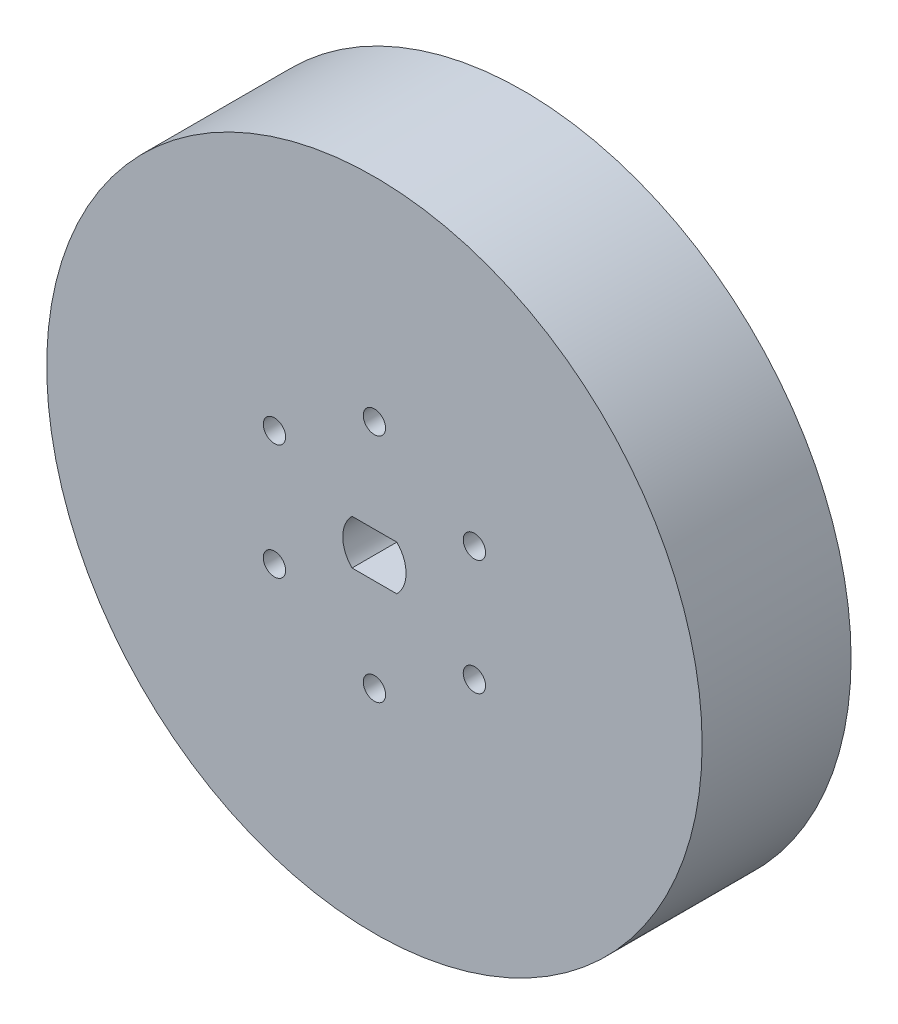
ISO-10303-21;
HEADER;
FILE_DESCRIPTION(('STEP AP214'),'2;1');
FILE_NAME('part.step','',(''),(''),'','','');
FILE_SCHEMA(('AUTOMOTIVE_DESIGN { 1 0 10303 214 1 1 1 1 }'));
ENDSEC;
DATA;
#1=APPLICATION_CONTEXT('core data for automotive mechanical design processes');
#2=APPLICATION_PROTOCOL_DEFINITION('international standard','automotive_design',2000,#1);
#3=PRODUCT_CONTEXT('',#1,'mechanical');
#4=PRODUCT('Part','Part','',(#3));
#5=PRODUCT_RELATED_PRODUCT_CATEGORY('part','',(#4));
#6=PRODUCT_DEFINITION_FORMATION('','',#4);
#7=PRODUCT_DEFINITION_CONTEXT('part definition',#1,'design');
#8=PRODUCT_DEFINITION('design','',#6,#7);
#9=PRODUCT_DEFINITION_SHAPE('','',#8);
#10=(LENGTH_UNIT() NAMED_UNIT(*) SI_UNIT(.MILLI.,.METRE.));
#11=(NAMED_UNIT(*) PLANE_ANGLE_UNIT() SI_UNIT($,.RADIAN.));
#12=(NAMED_UNIT(*) SI_UNIT($,.STERADIAN.) SOLID_ANGLE_UNIT());
#13=UNCERTAINTY_MEASURE_WITH_UNIT(LENGTH_MEASURE(1.E-05),#10,'distance_accuracy_value','');
#14=(GEOMETRIC_REPRESENTATION_CONTEXT(3) GLOBAL_UNCERTAINTY_ASSIGNED_CONTEXT((#13)) GLOBAL_UNIT_ASSIGNED_CONTEXT((#10,
#11,#12)) REPRESENTATION_CONTEXT('',''));
#15=CARTESIAN_POINT('',(0.,0.,0.));
#16=DIRECTION('',(0.,0.,1.));
#17=DIRECTION('',(1.,0.,0.));
#18=AXIS2_PLACEMENT_3D('',#15,#16,#17);
#19=CARTESIAN_POINT('',(-42.5704961768132,41.3632036033177,20.));
#20=DIRECTION('',(0.,0.,-1.));
#21=DIRECTION('',(-1.,0.,0.));
#22=AXIS2_PLACEMENT_3D('',#19,#20,#21);
#23=CYLINDRICAL_SURFACE('',#22,1.5);
#24=CARTESIAN_POINT('',(-42.5704961768132,41.3632036033177,20.));
#25=DIRECTION('',(0.,0.,-1.));
#26=DIRECTION('',(-1.,0.,0.));
#27=AXIS2_PLACEMENT_3D('',#24,#25,#26);
#28=CIRCLE('',#27,1.5);
#29=CARTESIAN_POINT('',(-44.0704961768132,41.3632036033177,20.));
#30=VERTEX_POINT('',#29);
#31=EDGE_CURVE('E136',#30,#30,#28,.T.);
#32=ORIENTED_EDGE('',*,*,#31,.F.);
#33=EDGE_LOOP('',(#32));
#34=FACE_BOUND('',#33,.T.);
#35=CARTESIAN_POINT('',(-42.5704961768132,41.3632036033177,3.));
#36=DIRECTION('',(0.,0.,-1.));
#37=DIRECTION('',(-1.,0.,0.));
#38=AXIS2_PLACEMENT_3D('',#35,#36,#37);
#39=CIRCLE('',#38,1.5);
#40=CARTESIAN_POINT('',(-44.0704961768132,41.3632036033177,3.));
#41=VERTEX_POINT('',#40);
#42=EDGE_CURVE('E45',#41,#41,#39,.F.);
#43=ORIENTED_EDGE('',*,*,#42,.F.);
#44=EDGE_LOOP('',(#43));
#45=FACE_BOUND('',#44,.T.);
#46=ADVANCED_FACE('F41',(#34,#45),#23,.F.);
#47=CARTESIAN_POINT('',(-42.5704961768132,25.8632036033177,20.));
#48=DIRECTION('',(0.,0.,-1.));
#49=DIRECTION('',(-1.,0.,0.));
#50=AXIS2_PLACEMENT_3D('',#47,#48,#49);
#51=CYLINDRICAL_SURFACE('',#50,4.25);
#52=CARTESIAN_POINT('',(-42.5704961768132,25.8632036033177,0.));
#53=DIRECTION('',(0.,0.,1.));
#54=DIRECTION('',(1.,0.,0.));
#55=AXIS2_PLACEMENT_3D('',#52,#53,#54);
#56=CIRCLE('',#55,4.25);
#57=CARTESIAN_POINT('',(-39.5652923567703,22.8579997832749,0.));
#58=VERTEX_POINT('',#57);
#59=CARTESIAN_POINT('',(-39.5652923567703,28.8684074233606,0.));
#60=VERTEX_POINT('',#59);
#61=EDGE_CURVE('E133',#58,#60,#56,.T.);
#62=ORIENTED_EDGE('',*,*,#61,.F.);
#63=DIRECTION('',(0.,0.,-1.));
#64=VECTOR('',#63,1.);
#65=CARTESIAN_POINT('',(-39.5652923567703,22.8579997832749,20.));
#66=LINE('',#65,#64);
#67=CARTESIAN_POINT('',(-39.5652923567703,22.8579997832749,20.));
#68=VERTEX_POINT('',#67);
#69=EDGE_CURVE('E11',#68,#58,#66,.T.);
#70=ORIENTED_EDGE('',*,*,#69,.F.);
#71=CARTESIAN_POINT('',(-42.5704961768132,25.8632036033177,20.));
#72=DIRECTION('',(0.,0.,1.));
#73=DIRECTION('',(1.,0.,0.));
#74=AXIS2_PLACEMENT_3D('',#71,#72,#73);
#75=CIRCLE('',#74,4.25);
#76=CARTESIAN_POINT('',(-39.5652923567703,28.8684074233606,20.));
#77=VERTEX_POINT('',#76);
#78=EDGE_CURVE('E93',#68,#77,#75,.T.);
#79=ORIENTED_EDGE('',*,*,#78,.T.);
#80=DIRECTION('',(0.,0.,-1.));
#81=VECTOR('',#80,1.);
#82=CARTESIAN_POINT('',(-39.5652923567703,28.8684074233606,20.));
#83=LINE('',#82,#81);
#84=EDGE_CURVE('E82',#77,#60,#83,.T.);
#85=ORIENTED_EDGE('',*,*,#84,.T.);
#86=EDGE_LOOP('',(#62,#70,#79,#85));
#87=FACE_BOUND('',#86,.T.);
#88=ADVANCED_FACE('F152',(#87),#51,.F.);
#89=CARTESIAN_POINT('',(0.,22.8579997832749,20.));
#90=DIRECTION('',(0.,-1.,0.));
#91=DIRECTION('',(1.,0.,0.));
#92=AXIS2_PLACEMENT_3D('',#89,#90,#91);
#93=PLANE('',#92);
#94=DIRECTION('',(-1.,0.,0.));
#95=VECTOR('',#94,1.);
#96=CARTESIAN_POINT('',(0.,22.8579997832749,0.));
#97=LINE('',#96,#95);
#98=CARTESIAN_POINT('',(-45.575699996856,22.8579997832749,0.));
#99=VERTEX_POINT('',#98);
#100=EDGE_CURVE('E99',#58,#99,#97,.T.);
#101=ORIENTED_EDGE('',*,*,#100,.T.);
#102=DIRECTION('',(0.,0.,-1.));
#103=VECTOR('',#102,1.);
#104=CARTESIAN_POINT('',(-45.575699996856,22.8579997832749,20.));
#105=LINE('',#104,#103);
#106=CARTESIAN_POINT('',(-45.575699996856,22.8579997832749,20.));
#107=VERTEX_POINT('',#106);
#108=EDGE_CURVE('E52',#107,#99,#105,.T.);
#109=ORIENTED_EDGE('',*,*,#108,.F.);
#110=DIRECTION('',(-1.,0.,0.));
#111=VECTOR('',#110,1.);
#112=CARTESIAN_POINT('',(0.,22.8579997832749,20.));
#113=LINE('',#112,#111);
#114=EDGE_CURVE('E87',#68,#107,#113,.T.);
#115=ORIENTED_EDGE('',*,*,#114,.F.);
#116=ORIENTED_EDGE('',*,*,#69,.T.);
#117=EDGE_LOOP('',(#101,#109,#115,#116));
#118=FACE_BOUND('',#117,.T.);
#119=ADVANCED_FACE('F43',(#118),#93,.F.);
#120=CARTESIAN_POINT('',(-45.575699996856,28.8684074233606,0.));
#121=VERTEX_POINT('',#120);
#122=EDGE_CURVE('E121',#121,#99,#56,.T.);
#123=ORIENTED_EDGE('',*,*,#122,.F.);
#124=DIRECTION('',(0.,0.,-1.));
#125=VECTOR('',#124,1.);
#126=CARTESIAN_POINT('',(-45.575699996856,28.8684074233606,20.));
#127=LINE('',#126,#125);
#128=CARTESIAN_POINT('',(-45.575699996856,28.8684074233606,20.));
#129=VERTEX_POINT('',#128);
#130=EDGE_CURVE('E75',#129,#121,#127,.T.);
#131=ORIENTED_EDGE('',*,*,#130,.F.);
#132=EDGE_CURVE('E92',#129,#107,#75,.T.);
#133=ORIENTED_EDGE('',*,*,#132,.T.);
#134=ORIENTED_EDGE('',*,*,#108,.T.);
#135=EDGE_LOOP('',(#123,#131,#133,#134));
#136=FACE_BOUND('',#135,.T.);
#137=ADVANCED_FACE('F105',(#136),#51,.F.);
#138=CARTESIAN_POINT('',(0.,28.8684074233606,20.));
#139=DIRECTION('',(0.,1.,0.));
#140=DIRECTION('',(0.,0.,1.));
#141=AXIS2_PLACEMENT_3D('',#138,#139,#140);
#142=PLANE('',#141);
#143=DIRECTION('',(1.,0.,0.));
#144=VECTOR('',#143,1.);
#145=CARTESIAN_POINT('',(0.,28.8684074233606,0.));
#146=LINE('',#145,#144);
#147=EDGE_CURVE('E116',#121,#60,#146,.T.);
#148=ORIENTED_EDGE('',*,*,#147,.T.);
#149=ORIENTED_EDGE('',*,*,#84,.F.);
#150=DIRECTION('',(1.,0.,0.));
#151=VECTOR('',#150,1.);
#152=CARTESIAN_POINT('',(0.,28.8684074233606,20.));
#153=LINE('',#152,#151);
#154=EDGE_CURVE('E60',#129,#77,#153,.T.);
#155=ORIENTED_EDGE('',*,*,#154,.F.);
#156=ORIENTED_EDGE('',*,*,#130,.T.);
#157=EDGE_LOOP('',(#148,#149,#155,#156));
#158=FACE_BOUND('',#157,.T.);
#159=ADVANCED_FACE('F142',(#158),#142,.F.);
#160=CARTESIAN_POINT('',(-42.5704961768132,25.8632036033177,20.));
#161=DIRECTION('',(0.,0.,-1.));
#162=DIRECTION('',(-1.,0.,0.));
#163=AXIS2_PLACEMENT_3D('',#160,#161,#162);
#164=CYLINDRICAL_SURFACE('',#163,44.);
#165=CARTESIAN_POINT('',(-42.5704961768132,25.8632036033177,20.));
#166=DIRECTION('',(0.,0.,1.));
#167=DIRECTION('',(1.,0.,0.));
#168=AXIS2_PLACEMENT_3D('',#165,#166,#167);
#169=CIRCLE('',#168,44.);
#170=CARTESIAN_POINT('',(1.42950382318684,25.8632036033177,20.));
#171=VERTEX_POINT('',#170);
#172=EDGE_CURVE('E109',#171,#171,#169,.T.);
#173=ORIENTED_EDGE('',*,*,#172,.F.);
#174=EDGE_LOOP('',(#173));
#175=FACE_BOUND('',#174,.T.);
#176=CARTESIAN_POINT('',(-42.5704961768132,25.8632036033177,0.));
#177=DIRECTION('',(0.,0.,1.));
#178=DIRECTION('',(1.,0.,0.));
#179=AXIS2_PLACEMENT_3D('',#176,#177,#178);
#180=CIRCLE('',#179,44.);
#181=CARTESIAN_POINT('',(1.42950382318684,25.8632036033177,0.));
#182=VERTEX_POINT('',#181);
#183=EDGE_CURVE('E113',#182,#182,#180,.T.);
#184=ORIENTED_EDGE('',*,*,#183,.T.);
#185=EDGE_LOOP('',(#184));
#186=FACE_BOUND('',#185,.T.);
#187=ADVANCED_FACE('F144',(#175,#186),#164,.T.);
#188=CARTESIAN_POINT('',(0.,0.,20.));
#189=DIRECTION('',(0.,0.,1.));
#190=DIRECTION('',(1.,0.,0.));
#191=AXIS2_PLACEMENT_3D('',#188,#189,#190);
#192=PLANE('',#191);
#193=CARTESIAN_POINT('',(-29.1471024181545,33.6132036033179,20.));
#194=DIRECTION('',(0.,0.,-1.));
#195=DIRECTION('',(-0.50000000000001,0.866025403784433,0.));
#196=AXIS2_PLACEMENT_3D('',#193,#194,#195);
#197=CIRCLE('',#196,1.5);
#198=CARTESIAN_POINT('',(-29.8971024181545,34.9122417089946,20.));
#199=VERTEX_POINT('',#198);
#200=EDGE_CURVE('E218',#199,#199,#197,.T.);
#201=ORIENTED_EDGE('',*,*,#200,.T.);
#202=EDGE_LOOP('',(#201));
#203=FACE_BOUND('',#202,.T.);
#204=CARTESIAN_POINT('',(-29.1471024181543,18.1132036033179,20.));
#205=DIRECTION('',(0.,0.,-1.));
#206=DIRECTION('',(0.499999999999992,0.866025403784443,0.));
#207=AXIS2_PLACEMENT_3D('',#204,#205,#206);
#208=CIRCLE('',#207,1.5);
#209=CARTESIAN_POINT('',(-28.3971024181543,19.4122417089945,20.));
#210=VERTEX_POINT('',#209);
#211=EDGE_CURVE('E222',#210,#210,#208,.T.);
#212=ORIENTED_EDGE('',*,*,#211,.T.);
#213=EDGE_LOOP('',(#212));
#214=FACE_BOUND('',#213,.T.);
#215=CARTESIAN_POINT('',(-42.5704961768132,10.3632036033178,20.));
#216=DIRECTION('',(0.,0.,-1.));
#217=DIRECTION('',(1.,0.,0.));
#218=AXIS2_PLACEMENT_3D('',#215,#216,#217);
#219=CIRCLE('',#218,1.5);
#220=CARTESIAN_POINT('',(-41.0704961768132,10.3632036033178,20.));
#221=VERTEX_POINT('',#220);
#222=EDGE_CURVE('E227',#221,#221,#219,.T.);
#223=ORIENTED_EDGE('',*,*,#222,.T.);
#224=EDGE_LOOP('',(#223));
#225=FACE_BOUND('',#224,.T.);
#226=CARTESIAN_POINT('',(-55.9938899354719,18.1132036033177,20.));
#227=DIRECTION('',(0.,0.,-1.));
#228=DIRECTION('',(0.500000000000004,-0.866025403784436,0.));
#229=AXIS2_PLACEMENT_3D('',#226,#227,#228);
#230=CIRCLE('',#229,1.5);
#231=CARTESIAN_POINT('',(-55.2438899354719,16.814165497641,20.));
#232=VERTEX_POINT('',#231);
#233=EDGE_CURVE('E208',#232,#232,#230,.T.);
#234=ORIENTED_EDGE('',*,*,#233,.T.);
#235=EDGE_LOOP('',(#234));
#236=FACE_BOUND('',#235,.T.);
#237=CARTESIAN_POINT('',(-55.993889935472,33.6132036033177,20.));
#238=DIRECTION('',(0.,0.,-1.));
#239=DIRECTION('',(-0.499999999999998,-0.86602540378444,0.));
#240=AXIS2_PLACEMENT_3D('',#237,#238,#239);
#241=CIRCLE('',#240,1.5);
#242=CARTESIAN_POINT('',(-56.743889935472,32.314165497641,20.));
#243=VERTEX_POINT('',#242);
#244=EDGE_CURVE('E201',#243,#243,#241,.T.);
#245=ORIENTED_EDGE('',*,*,#244,.T.);
#246=EDGE_LOOP('',(#245));
#247=FACE_BOUND('',#246,.T.);
#248=ORIENTED_EDGE('',*,*,#31,.T.);
#249=EDGE_LOOP('',(#248));
#250=FACE_BOUND('',#249,.T.);
#251=ORIENTED_EDGE('',*,*,#78,.F.);
#252=ORIENTED_EDGE('',*,*,#114,.T.);
#253=ORIENTED_EDGE('',*,*,#132,.F.);
#254=ORIENTED_EDGE('',*,*,#154,.T.);
#255=EDGE_LOOP('',(#251,#252,#253,#254));
#256=FACE_BOUND('',#255,.T.);
#257=ORIENTED_EDGE('',*,*,#172,.T.);
#258=EDGE_LOOP('',(#257));
#259=FACE_BOUND('',#258,.T.);
#260=ADVANCED_FACE('F89',(#203,#214,#225,#236,#247,#250,#256,#259),#192,.T.);
#261=CARTESIAN_POINT('',(0.,0.,0.));
#262=DIRECTION('',(0.,0.,1.));
#263=DIRECTION('',(1.,0.,0.));
#264=AXIS2_PLACEMENT_3D('',#261,#262,#263);
#265=PLANE('',#264);
#266=CARTESIAN_POINT('',(-29.1471024181545,33.6132036033179,0.));
#267=DIRECTION('',(0.,0.,-1.));
#268=DIRECTION('',(-0.50000000000001,0.866025403784433,0.));
#269=AXIS2_PLACEMENT_3D('',#266,#267,#268);
#270=CIRCLE('',#269,3.);
#271=CARTESIAN_POINT('',(-30.6471024181545,36.2112798146712,0.));
#272=VERTEX_POINT('',#271);
#273=EDGE_CURVE('E178',#272,#272,#270,.T.);
#274=ORIENTED_EDGE('',*,*,#273,.F.);
#275=EDGE_LOOP('',(#274));
#276=FACE_BOUND('',#275,.T.);
#277=CARTESIAN_POINT('',(-29.1471024181543,18.1132036033179,0.));
#278=DIRECTION('',(0.,0.,-1.));
#279=DIRECTION('',(0.499999999999992,0.866025403784443,0.));
#280=AXIS2_PLACEMENT_3D('',#277,#278,#279);
#281=CIRCLE('',#280,3.);
#282=CARTESIAN_POINT('',(-27.6471024181543,20.7112798146712,0.));
#283=VERTEX_POINT('',#282);
#284=EDGE_CURVE('E182',#283,#283,#281,.T.);
#285=ORIENTED_EDGE('',*,*,#284,.F.);
#286=EDGE_LOOP('',(#285));
#287=FACE_BOUND('',#286,.T.);
#288=CARTESIAN_POINT('',(-42.5704961768132,10.3632036033178,0.));
#289=DIRECTION('',(0.,0.,-1.));
#290=DIRECTION('',(1.,0.,0.));
#291=AXIS2_PLACEMENT_3D('',#288,#289,#290);
#292=CIRCLE('',#291,3.);
#293=CARTESIAN_POINT('',(-39.5704961768132,10.3632036033178,0.));
#294=VERTEX_POINT('',#293);
#295=EDGE_CURVE('E186',#294,#294,#292,.T.);
#296=ORIENTED_EDGE('',*,*,#295,.F.);
#297=EDGE_LOOP('',(#296));
#298=FACE_BOUND('',#297,.T.);
#299=CARTESIAN_POINT('',(-55.9938899354719,18.1132036033177,0.));
#300=DIRECTION('',(0.,0.,-1.));
#301=DIRECTION('',(0.500000000000004,-0.866025403784436,0.));
#302=AXIS2_PLACEMENT_3D('',#299,#300,#301);
#303=CIRCLE('',#302,3.);
#304=CARTESIAN_POINT('',(-54.4938899354719,15.5151273919644,0.));
#305=VERTEX_POINT('',#304);
#306=EDGE_CURVE('E190',#305,#305,#303,.T.);
#307=ORIENTED_EDGE('',*,*,#306,.F.);
#308=EDGE_LOOP('',(#307));
#309=FACE_BOUND('',#308,.T.);
#310=CARTESIAN_POINT('',(-55.993889935472,33.6132036033177,0.));
#311=DIRECTION('',(0.,0.,-1.));
#312=DIRECTION('',(-0.499999999999998,-0.86602540378444,0.));
#313=AXIS2_PLACEMENT_3D('',#310,#311,#312);
#314=CIRCLE('',#313,3.);
#315=CARTESIAN_POINT('',(-57.493889935472,31.0151273919644,0.));
#316=VERTEX_POINT('',#315);
#317=EDGE_CURVE('E194',#316,#316,#314,.T.);
#318=ORIENTED_EDGE('',*,*,#317,.F.);
#319=EDGE_LOOP('',(#318));
#320=FACE_BOUND('',#319,.T.);
#321=CARTESIAN_POINT('',(-42.5704961768132,41.3632036033177,0.));
#322=DIRECTION('',(0.,0.,-1.));
#323=DIRECTION('',(-1.,0.,0.));
#324=AXIS2_PLACEMENT_3D('',#321,#322,#323);
#325=CIRCLE('',#324,3.);
#326=CARTESIAN_POINT('',(-45.5704961768132,41.3632036033177,0.));
#327=VERTEX_POINT('',#326);
#328=EDGE_CURVE('E197',#327,#327,#325,.T.);
#329=ORIENTED_EDGE('',*,*,#328,.F.);
#330=EDGE_LOOP('',(#329));
#331=FACE_BOUND('',#330,.T.);
#332=ORIENTED_EDGE('',*,*,#61,.T.);
#333=ORIENTED_EDGE('',*,*,#147,.F.);
#334=ORIENTED_EDGE('',*,*,#122,.T.);
#335=ORIENTED_EDGE('',*,*,#100,.F.);
#336=EDGE_LOOP('',(#332,#333,#334,#335));
#337=FACE_BOUND('',#336,.T.);
#338=ORIENTED_EDGE('',*,*,#183,.F.);
#339=EDGE_LOOP('',(#338));
#340=FACE_BOUND('',#339,.T.);
#341=ADVANCED_FACE('F140',(#276,#287,#298,#309,#320,#331,#337,#340),#265,.F.);
#342=CARTESIAN_POINT('',(-42.5704961768132,41.3632036033177,3.));
#343=DIRECTION('',(0.,0.,-1.));
#344=DIRECTION('',(-1.,0.,0.));
#345=AXIS2_PLACEMENT_3D('',#342,#343,#344);
#346=PLANE('',#345);
#347=CARTESIAN_POINT('',(-42.5704961768132,41.3632036033177,3.));
#348=DIRECTION('',(0.,0.,-1.));
#349=DIRECTION('',(-1.,0.,0.));
#350=AXIS2_PLACEMENT_3D('',#347,#348,#349);
#351=CIRCLE('',#350,3.);
#352=CARTESIAN_POINT('',(-45.5704961768132,41.3632036033177,3.));
#353=VERTEX_POINT('',#352);
#354=EDGE_CURVE('E200',#353,#353,#351,.T.);
#355=ORIENTED_EDGE('',*,*,#354,.T.);
#356=EDGE_LOOP('',(#355));
#357=FACE_BOUND('',#356,.T.);
#358=ORIENTED_EDGE('',*,*,#42,.T.);
#359=EDGE_LOOP('',(#358));
#360=FACE_BOUND('',#359,.T.);
#361=ADVANCED_FACE('F169',(#357,#360),#346,.T.);
#362=CARTESIAN_POINT('',(-42.5704961768132,41.3632036033177,3.));
#363=DIRECTION('',(0.,0.,-1.));
#364=DIRECTION('',(-1.,0.,0.));
#365=AXIS2_PLACEMENT_3D('',#362,#363,#364);
#366=CYLINDRICAL_SURFACE('',#365,3.);
#367=ORIENTED_EDGE('',*,*,#354,.F.);
#368=EDGE_LOOP('',(#367));
#369=FACE_BOUND('',#368,.T.);
#370=ORIENTED_EDGE('',*,*,#328,.T.);
#371=EDGE_LOOP('',(#370));
#372=FACE_BOUND('',#371,.T.);
#373=ADVANCED_FACE('F163',(#369,#372),#366,.F.);
#374=CARTESIAN_POINT('',(-55.993889935472,33.6132036033177,20.));
#375=DIRECTION('',(0.,0.,-1.));
#376=DIRECTION('',(-0.499999999999998,-0.86602540378444,0.));
#377=AXIS2_PLACEMENT_3D('',#374,#375,#376);
#378=CYLINDRICAL_SURFACE('',#377,1.5);
#379=ORIENTED_EDGE('',*,*,#244,.F.);
#380=EDGE_LOOP('',(#379));
#381=FACE_BOUND('',#380,.T.);
#382=CARTESIAN_POINT('',(-55.993889935472,33.6132036033177,3.));
#383=DIRECTION('',(0.,0.,-1.));
#384=DIRECTION('',(-1.,0.,0.));
#385=AXIS2_PLACEMENT_3D('',#382,#383,#384);
#386=CIRCLE('',#385,1.5);
#387=CARTESIAN_POINT('',(-57.493889935472,33.6132036033177,3.));
#388=VERTEX_POINT('',#387);
#389=EDGE_CURVE('E223',#388,#388,#386,.F.);
#390=ORIENTED_EDGE('',*,*,#389,.F.);
#391=EDGE_LOOP('',(#390));
#392=FACE_BOUND('',#391,.T.);
#393=ADVANCED_FACE('F332',(#381,#392),#378,.F.);
#394=CARTESIAN_POINT('',(-55.9938899354719,18.1132036033177,20.));
#395=DIRECTION('',(0.,0.,-1.));
#396=DIRECTION('',(0.500000000000004,-0.866025403784436,0.));
#397=AXIS2_PLACEMENT_3D('',#394,#395,#396);
#398=CYLINDRICAL_SURFACE('',#397,1.5);
#399=ORIENTED_EDGE('',*,*,#233,.F.);
#400=EDGE_LOOP('',(#399));
#401=FACE_BOUND('',#400,.T.);
#402=CARTESIAN_POINT('',(-55.9938899354719,18.1132036033177,3.));
#403=DIRECTION('',(0.,0.,-1.));
#404=DIRECTION('',(-1.,0.,0.));
#405=AXIS2_PLACEMENT_3D('',#402,#403,#404);
#406=CIRCLE('',#405,1.5);
#407=CARTESIAN_POINT('',(-57.4938899354719,18.1132036033177,3.));
#408=VERTEX_POINT('',#407);
#409=EDGE_CURVE('E237',#408,#408,#406,.F.);
#410=ORIENTED_EDGE('',*,*,#409,.F.);
#411=EDGE_LOOP('',(#410));
#412=FACE_BOUND('',#411,.T.);
#413=ADVANCED_FACE('F328',(#401,#412),#398,.F.);
#414=CARTESIAN_POINT('',(-42.5704961768132,10.3632036033178,20.));
#415=DIRECTION('',(0.,0.,-1.));
#416=DIRECTION('',(1.,0.,0.));
#417=AXIS2_PLACEMENT_3D('',#414,#415,#416);
#418=CYLINDRICAL_SURFACE('',#417,1.5);
#419=ORIENTED_EDGE('',*,*,#222,.F.);
#420=EDGE_LOOP('',(#419));
#421=FACE_BOUND('',#420,.T.);
#422=CARTESIAN_POINT('',(-42.5704961768132,10.3632036033178,3.));
#423=DIRECTION('',(0.,0.,-1.));
#424=DIRECTION('',(-1.,0.,0.));
#425=AXIS2_PLACEMENT_3D('',#422,#423,#424);
#426=CIRCLE('',#425,1.5);
#427=CARTESIAN_POINT('',(-44.0704961768132,10.3632036033178,3.));
#428=VERTEX_POINT('',#427);
#429=EDGE_CURVE('E241',#428,#428,#426,.F.);
#430=ORIENTED_EDGE('',*,*,#429,.F.);
#431=EDGE_LOOP('',(#430));
#432=FACE_BOUND('',#431,.T.);
#433=ADVANCED_FACE('F331',(#421,#432),#418,.F.);
#434=CARTESIAN_POINT('',(-29.1471024181543,18.1132036033179,20.));
#435=DIRECTION('',(0.,0.,-1.));
#436=DIRECTION('',(0.499999999999992,0.866025403784443,0.));
#437=AXIS2_PLACEMENT_3D('',#434,#435,#436);
#438=CYLINDRICAL_SURFACE('',#437,1.5);
#439=ORIENTED_EDGE('',*,*,#211,.F.);
#440=EDGE_LOOP('',(#439));
#441=FACE_BOUND('',#440,.T.);
#442=CARTESIAN_POINT('',(-29.1471024181543,18.1132036033179,3.));
#443=DIRECTION('',(0.,0.,-1.));
#444=DIRECTION('',(-1.,0.,0.));
#445=AXIS2_PLACEMENT_3D('',#442,#443,#444);
#446=CIRCLE('',#445,1.5);
#447=CARTESIAN_POINT('',(-30.6471024181543,18.1132036033179,3.));
#448=VERTEX_POINT('',#447);
#449=EDGE_CURVE('E245',#448,#448,#446,.F.);
#450=ORIENTED_EDGE('',*,*,#449,.F.);
#451=EDGE_LOOP('',(#450));
#452=FACE_BOUND('',#451,.T.);
#453=ADVANCED_FACE('F336',(#441,#452),#438,.F.);
#454=CARTESIAN_POINT('',(-29.1471024181545,33.6132036033179,20.));
#455=DIRECTION('',(0.,0.,-1.));
#456=DIRECTION('',(-0.50000000000001,0.866025403784433,0.));
#457=AXIS2_PLACEMENT_3D('',#454,#455,#456);
#458=CYLINDRICAL_SURFACE('',#457,1.5);
#459=ORIENTED_EDGE('',*,*,#200,.F.);
#460=EDGE_LOOP('',(#459));
#461=FACE_BOUND('',#460,.T.);
#462=CARTESIAN_POINT('',(-29.1471024181545,33.6132036033179,3.));
#463=DIRECTION('',(0.,0.,-1.));
#464=DIRECTION('',(-1.,0.,0.));
#465=AXIS2_PLACEMENT_3D('',#462,#463,#464);
#466=CIRCLE('',#465,1.5);
#467=CARTESIAN_POINT('',(-30.6471024181545,33.6132036033179,3.));
#468=VERTEX_POINT('',#467);
#469=EDGE_CURVE('E249',#468,#468,#466,.F.);
#470=ORIENTED_EDGE('',*,*,#469,.F.);
#471=EDGE_LOOP('',(#470));
#472=FACE_BOUND('',#471,.T.);
#473=ADVANCED_FACE('F323',(#461,#472),#458,.F.);
#474=CARTESIAN_POINT('',(-29.1471024181545,33.6132036033179,3.));
#475=DIRECTION('',(0.,0.,-1.));
#476=DIRECTION('',(-0.50000000000001,0.866025403784433,0.));
#477=AXIS2_PLACEMENT_3D('',#474,#475,#476);
#478=PLANE('',#477);
#479=CARTESIAN_POINT('',(-29.1471024181545,33.6132036033179,3.));
#480=DIRECTION('',(0.,0.,-1.));
#481=DIRECTION('',(-0.50000000000001,0.866025403784433,0.));
#482=AXIS2_PLACEMENT_3D('',#479,#480,#481);
#483=CIRCLE('',#482,3.);
#484=CARTESIAN_POINT('',(-30.6471024181545,36.2112798146712,3.));
#485=VERTEX_POINT('',#484);
#486=EDGE_CURVE('E260',#485,#485,#483,.T.);
#487=ORIENTED_EDGE('',*,*,#486,.T.);
#488=EDGE_LOOP('',(#487));
#489=FACE_BOUND('',#488,.T.);
#490=ORIENTED_EDGE('',*,*,#469,.T.);
#491=EDGE_LOOP('',(#490));
#492=FACE_BOUND('',#491,.T.);
#493=ADVANCED_FACE('F319',(#489,#492),#478,.T.);
#494=CARTESIAN_POINT('',(-29.1471024181545,33.6132036033179,3.));
#495=DIRECTION('',(0.,0.,-1.));
#496=DIRECTION('',(-0.50000000000001,0.866025403784433,0.));
#497=AXIS2_PLACEMENT_3D('',#494,#495,#496);
#498=CYLINDRICAL_SURFACE('',#497,3.);
#499=ORIENTED_EDGE('',*,*,#486,.F.);
#500=EDGE_LOOP('',(#499));
#501=FACE_BOUND('',#500,.T.);
#502=ORIENTED_EDGE('',*,*,#273,.T.);
#503=EDGE_LOOP('',(#502));
#504=FACE_BOUND('',#503,.T.);
#505=ADVANCED_FACE('F315',(#501,#504),#498,.F.);
#506=CARTESIAN_POINT('',(-29.1471024181543,18.1132036033179,3.));
#507=DIRECTION('',(0.,0.,-1.));
#508=DIRECTION('',(0.499999999999992,0.866025403784443,0.));
#509=AXIS2_PLACEMENT_3D('',#506,#507,#508);
#510=PLANE('',#509);
#511=CARTESIAN_POINT('',(-29.1471024181543,18.1132036033179,3.));
#512=DIRECTION('',(0.,0.,-1.));
#513=DIRECTION('',(0.499999999999992,0.866025403784443,0.));
#514=AXIS2_PLACEMENT_3D('',#511,#512,#513);
#515=CIRCLE('',#514,3.);
#516=CARTESIAN_POINT('',(-27.6471024181543,20.7112798146712,3.));
#517=VERTEX_POINT('',#516);
#518=EDGE_CURVE('E266',#517,#517,#515,.T.);
#519=ORIENTED_EDGE('',*,*,#518,.T.);
#520=EDGE_LOOP('',(#519));
#521=FACE_BOUND('',#520,.T.);
#522=ORIENTED_EDGE('',*,*,#449,.T.);
#523=EDGE_LOOP('',(#522));
#524=FACE_BOUND('',#523,.T.);
#525=ADVANCED_FACE('F311',(#521,#524),#510,.T.);
#526=CARTESIAN_POINT('',(-29.1471024181543,18.1132036033179,3.));
#527=DIRECTION('',(0.,0.,-1.));
#528=DIRECTION('',(0.499999999999992,0.866025403784443,0.));
#529=AXIS2_PLACEMENT_3D('',#526,#527,#528);
#530=CYLINDRICAL_SURFACE('',#529,3.);
#531=ORIENTED_EDGE('',*,*,#518,.F.);
#532=EDGE_LOOP('',(#531));
#533=FACE_BOUND('',#532,.T.);
#534=ORIENTED_EDGE('',*,*,#284,.T.);
#535=EDGE_LOOP('',(#534));
#536=FACE_BOUND('',#535,.T.);
#537=ADVANCED_FACE('F307',(#533,#536),#530,.F.);
#538=CARTESIAN_POINT('',(-42.5704961768132,10.3632036033178,3.));
#539=DIRECTION('',(0.,0.,-1.));
#540=DIRECTION('',(1.,0.,0.));
#541=AXIS2_PLACEMENT_3D('',#538,#539,#540);
#542=PLANE('',#541);
#543=CARTESIAN_POINT('',(-42.5704961768132,10.3632036033178,3.));
#544=DIRECTION('',(0.,0.,-1.));
#545=DIRECTION('',(1.,0.,0.));
#546=AXIS2_PLACEMENT_3D('',#543,#544,#545);
#547=CIRCLE('',#546,3.);
#548=CARTESIAN_POINT('',(-39.5704961768132,10.3632036033178,3.));
#549=VERTEX_POINT('',#548);
#550=EDGE_CURVE('E272',#549,#549,#547,.T.);
#551=ORIENTED_EDGE('',*,*,#550,.T.);
#552=EDGE_LOOP('',(#551));
#553=FACE_BOUND('',#552,.T.);
#554=ORIENTED_EDGE('',*,*,#429,.T.);
#555=EDGE_LOOP('',(#554));
#556=FACE_BOUND('',#555,.T.);
#557=ADVANCED_FACE('F303',(#553,#556),#542,.T.);
#558=CARTESIAN_POINT('',(-42.5704961768132,10.3632036033178,3.));
#559=DIRECTION('',(0.,0.,-1.));
#560=DIRECTION('',(1.,0.,0.));
#561=AXIS2_PLACEMENT_3D('',#558,#559,#560);
#562=CYLINDRICAL_SURFACE('',#561,3.);
#563=ORIENTED_EDGE('',*,*,#550,.F.);
#564=EDGE_LOOP('',(#563));
#565=FACE_BOUND('',#564,.T.);
#566=ORIENTED_EDGE('',*,*,#295,.T.);
#567=EDGE_LOOP('',(#566));
#568=FACE_BOUND('',#567,.T.);
#569=ADVANCED_FACE('F296',(#565,#568),#562,.F.);
#570=CARTESIAN_POINT('',(-55.9938899354719,18.1132036033177,3.));
#571=DIRECTION('',(0.,0.,-1.));
#572=DIRECTION('',(0.500000000000004,-0.866025403784436,0.));
#573=AXIS2_PLACEMENT_3D('',#570,#571,#572);
#574=PLANE('',#573);
#575=CARTESIAN_POINT('',(-55.9938899354719,18.1132036033177,3.));
#576=DIRECTION('',(0.,0.,-1.));
#577=DIRECTION('',(0.500000000000004,-0.866025403784436,0.));
#578=AXIS2_PLACEMENT_3D('',#575,#576,#577);
#579=CIRCLE('',#578,3.);
#580=CARTESIAN_POINT('',(-54.4938899354719,15.5151273919644,3.));
#581=VERTEX_POINT('',#580);
#582=EDGE_CURVE('E259',#581,#581,#579,.T.);
#583=ORIENTED_EDGE('',*,*,#582,.T.);
#584=EDGE_LOOP('',(#583));
#585=FACE_BOUND('',#584,.T.);
#586=ORIENTED_EDGE('',*,*,#409,.T.);
#587=EDGE_LOOP('',(#586));
#588=FACE_BOUND('',#587,.T.);
#589=ADVANCED_FACE('F286',(#585,#588),#574,.T.);
#590=CARTESIAN_POINT('',(-55.9938899354719,18.1132036033177,3.));
#591=DIRECTION('',(0.,0.,-1.));
#592=DIRECTION('',(0.500000000000004,-0.866025403784436,0.));
#593=AXIS2_PLACEMENT_3D('',#590,#591,#592);
#594=CYLINDRICAL_SURFACE('',#593,3.);
#595=ORIENTED_EDGE('',*,*,#582,.F.);
#596=EDGE_LOOP('',(#595));
#597=FACE_BOUND('',#596,.T.);
#598=ORIENTED_EDGE('',*,*,#306,.T.);
#599=EDGE_LOOP('',(#598));
#600=FACE_BOUND('',#599,.T.);
#601=ADVANCED_FACE('F283',(#597,#600),#594,.F.);
#602=CARTESIAN_POINT('',(-55.993889935472,33.6132036033177,3.));
#603=DIRECTION('',(0.,0.,-1.));
#604=DIRECTION('',(-0.499999999999998,-0.86602540378444,0.));
#605=AXIS2_PLACEMENT_3D('',#602,#603,#604);
#606=PLANE('',#605);
#607=CARTESIAN_POINT('',(-55.993889935472,33.6132036033177,3.));
#608=DIRECTION('',(0.,0.,-1.));
#609=DIRECTION('',(-0.499999999999998,-0.86602540378444,0.));
#610=AXIS2_PLACEMENT_3D('',#607,#608,#609);
#611=CIRCLE('',#610,3.);
#612=CARTESIAN_POINT('',(-57.493889935472,31.0151273919644,3.));
#613=VERTEX_POINT('',#612);
#614=EDGE_CURVE('E253',#613,#613,#611,.T.);
#615=ORIENTED_EDGE('',*,*,#614,.T.);
#616=EDGE_LOOP('',(#615));
#617=FACE_BOUND('',#616,.T.);
#618=ORIENTED_EDGE('',*,*,#389,.T.);
#619=EDGE_LOOP('',(#618));
#620=FACE_BOUND('',#619,.T.);
#621=ADVANCED_FACE('F285',(#617,#620),#606,.T.);
#622=CARTESIAN_POINT('',(-55.993889935472,33.6132036033177,3.));
#623=DIRECTION('',(0.,0.,-1.));
#624=DIRECTION('',(-0.499999999999998,-0.86602540378444,0.));
#625=AXIS2_PLACEMENT_3D('',#622,#623,#624);
#626=CYLINDRICAL_SURFACE('',#625,3.);
#627=ORIENTED_EDGE('',*,*,#614,.F.);
#628=EDGE_LOOP('',(#627));
#629=FACE_BOUND('',#628,.T.);
#630=ORIENTED_EDGE('',*,*,#317,.T.);
#631=EDGE_LOOP('',(#630));
#632=FACE_BOUND('',#631,.T.);
#633=ADVANCED_FACE('F293',(#629,#632),#626,.F.);
#634=CLOSED_SHELL('',(#46,#88,#119,#137,#159,#187,#260,#341,#361,#373,#393,#413,#433,#453,#473,
#493,#505,#525,#537,#557,#569,#589,#601,#621,#633));
#635=MANIFOLD_SOLID_BREP('B2',#634);
#636=ADVANCED_BREP_SHAPE_REPRESENTATION('',(#18,#635),#14);
#637=SHAPE_DEFINITION_REPRESENTATION(#9,#636);
ENDSEC;
END-ISO-10303-21;
